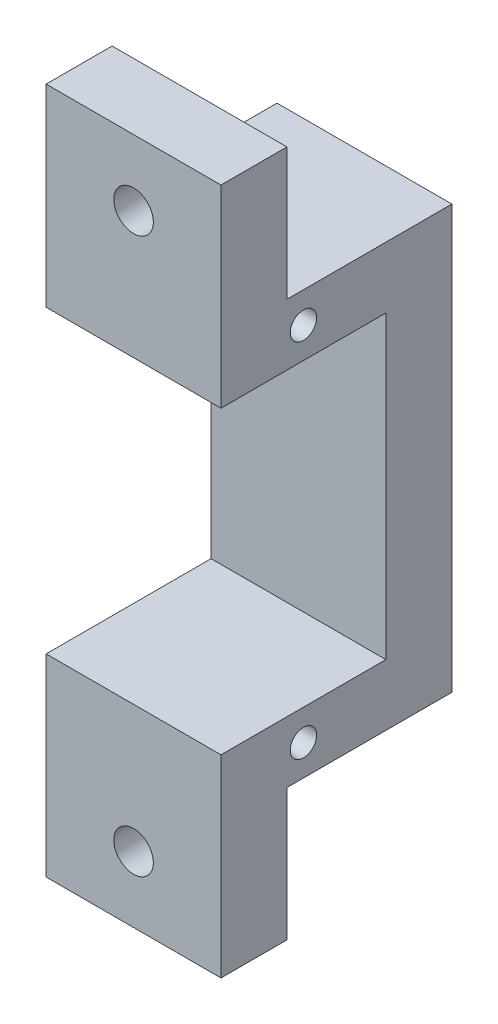
ISO-10303-21;
HEADER;
FILE_DESCRIPTION(('STEP AP214'),'2;1');
FILE_NAME('part.step','',(''),(''),'','','');
FILE_SCHEMA(('AUTOMOTIVE_DESIGN { 1 0 10303 214 1 1 1 1 }'));
ENDSEC;
DATA;
#1=APPLICATION_CONTEXT('core data for automotive mechanical design processes');
#2=APPLICATION_PROTOCOL_DEFINITION('international standard','automotive_design',2000,#1);
#3=PRODUCT_CONTEXT('',#1,'mechanical');
#4=PRODUCT('Part','Part','',(#3));
#5=PRODUCT_RELATED_PRODUCT_CATEGORY('part','',(#4));
#6=PRODUCT_DEFINITION_FORMATION('','',#4);
#7=PRODUCT_DEFINITION_CONTEXT('part definition',#1,'design');
#8=PRODUCT_DEFINITION('design','',#6,#7);
#9=PRODUCT_DEFINITION_SHAPE('','',#8);
#10=(LENGTH_UNIT() NAMED_UNIT(*) SI_UNIT(.MILLI.,.METRE.));
#11=(NAMED_UNIT(*) PLANE_ANGLE_UNIT() SI_UNIT($,.RADIAN.));
#12=(NAMED_UNIT(*) SI_UNIT($,.STERADIAN.) SOLID_ANGLE_UNIT());
#13=UNCERTAINTY_MEASURE_WITH_UNIT(LENGTH_MEASURE(1.E-05),#10,'distance_accuracy_value','');
#14=(GEOMETRIC_REPRESENTATION_CONTEXT(3) GLOBAL_UNCERTAINTY_ASSIGNED_CONTEXT((#13)) GLOBAL_UNIT_ASSIGNED_CONTEXT((#10,
#11,#12)) REPRESENTATION_CONTEXT('',''));
#15=CARTESIAN_POINT('',(0.,0.,0.));
#16=DIRECTION('',(0.,0.,1.));
#17=DIRECTION('',(1.,0.,0.));
#18=AXIS2_PLACEMENT_3D('',#15,#16,#17);
#19=CARTESIAN_POINT('',(-21.7379181981433,-32.05,1.16179769840603));
#20=DIRECTION('',(0.,1.,0.));
#21=DIRECTION('',(-1.,0.,0.));
#22=AXIS2_PLACEMENT_3D('',#19,#20,#21);
#23=PLANE('',#22);
#24=DIRECTION('',(1.,0.,0.));
#25=VECTOR('',#24,1.);
#26=CARTESIAN_POINT('',(-21.7379181981433,-32.05,13.661797698406));
#27=LINE('',#26,#25);
#28=CARTESIAN_POINT('',(-21.7379181981433,-32.05,13.661797698406));
#29=VERTEX_POINT('',#28);
#30=CARTESIAN_POINT('',(-8.48791819814331,-32.05,13.661797698406));
#31=VERTEX_POINT('',#30);
#32=EDGE_CURVE('E55',#29,#31,#27,.T.);
#33=ORIENTED_EDGE('',*,*,#32,.F.);
#34=DIRECTION('',(0.,0.,1.));
#35=VECTOR('',#34,1.);
#36=CARTESIAN_POINT('',(-21.7379181981433,-32.05,1.16179769840603));
#37=LINE('',#36,#35);
#38=CARTESIAN_POINT('',(-21.7379181981433,-32.05,1.16179769840603));
#39=VERTEX_POINT('',#38);
#40=EDGE_CURVE('E199',#39,#29,#37,.T.);
#41=ORIENTED_EDGE('',*,*,#40,.F.);
#42=DIRECTION('',(-1.,0.,0.));
#43=VECTOR('',#42,1.);
#44=CARTESIAN_POINT('',(-21.7379181981433,-32.05,1.16179769840603));
#45=LINE('',#44,#43);
#46=CARTESIAN_POINT('',(-8.48791819814331,-32.05,1.16179769840603));
#47=VERTEX_POINT('',#46);
#48=EDGE_CURVE('E197',#47,#39,#45,.T.);
#49=ORIENTED_EDGE('',*,*,#48,.F.);
#50=DIRECTION('',(0.,0.,1.));
#51=VECTOR('',#50,1.);
#52=CARTESIAN_POINT('',(-8.48791819814331,-32.05,1.16179769840603));
#53=LINE('',#52,#51);
#54=EDGE_CURVE('E204',#47,#31,#53,.T.);
#55=ORIENTED_EDGE('',*,*,#54,.T.);
#56=EDGE_LOOP('',(#33,#41,#49,#55));
#57=FACE_BOUND('',#56,.T.);
#58=ADVANCED_FACE('F32',(#57),#23,.F.);
#59=CARTESIAN_POINT('',(0.,0.,6.16179769840603));
#60=DIRECTION('',(0.,0.,1.));
#61=DIRECTION('',(1.,0.,0.));
#62=AXIS2_PLACEMENT_3D('',#59,#60,#61);
#63=PLANE('',#62);
#64=DIRECTION('',(0.,1.,0.));
#65=VECTOR('',#64,1.);
#66=CARTESIAN_POINT('',(-21.7379181981433,0.,6.16179769840603));
#67=LINE('',#66,#65);
#68=CARTESIAN_POINT('',(-21.7379181981433,-27.4,6.16179769840603));
#69=VERTEX_POINT('',#68);
#70=CARTESIAN_POINT('',(-21.7379181981433,-4.65,6.16179769840603));
#71=VERTEX_POINT('',#70);
#72=EDGE_CURVE('E187',#69,#71,#67,.T.);
#73=ORIENTED_EDGE('',*,*,#72,.F.);
#74=DIRECTION('',(-1.,0.,0.));
#75=VECTOR('',#74,1.);
#76=CARTESIAN_POINT('',(-8.48791819814331,-27.4,6.16179769840603));
#77=LINE('',#76,#75);
#78=CARTESIAN_POINT('',(-8.48791819814331,-27.4,6.16179769840603));
#79=VERTEX_POINT('',#78);
#80=EDGE_CURVE('E173',#79,#69,#77,.T.);
#81=ORIENTED_EDGE('',*,*,#80,.F.);
#82=DIRECTION('',(0.,-1.,0.));
#83=VECTOR('',#82,1.);
#84=CARTESIAN_POINT('',(-8.4879181981433,0.,6.16179769840603));
#85=LINE('',#84,#83);
#86=CARTESIAN_POINT('',(-8.4879181981433,-4.65,6.16179769840603));
#87=VERTEX_POINT('',#86);
#88=EDGE_CURVE('E192',#87,#79,#85,.T.);
#89=ORIENTED_EDGE('',*,*,#88,.F.);
#90=DIRECTION('',(-1.,0.,0.));
#91=VECTOR('',#90,1.);
#92=CARTESIAN_POINT('',(-21.7379181981433,-4.65,6.16179769840603));
#93=LINE('',#92,#91);
#94=EDGE_CURVE('E130',#87,#71,#93,.T.);
#95=ORIENTED_EDGE('',*,*,#94,.T.);
#96=EDGE_LOOP('',(#73,#81,#89,#95));
#97=FACE_BOUND('',#96,.T.);
#98=ADVANCED_FACE('F240',(#97),#63,.T.);
#99=CARTESIAN_POINT('',(-21.7379181981433,-4.65,6.16179769840603));
#100=DIRECTION('',(-1.,0.,0.));
#101=DIRECTION('',(0.,0.,1.));
#102=AXIS2_PLACEMENT_3D('',#99,#100,#101);
#103=PLANE('',#102);
#104=CARTESIAN_POINT('',(-21.7379181981433,-29.725,12.411797698406));
#105=DIRECTION('',(1.,0.,0.));
#106=DIRECTION('',(0.,0.,-1.));
#107=AXIS2_PLACEMENT_3D('',#104,#105,#106);
#108=CIRCLE('',#107,1.);
#109=CARTESIAN_POINT('',(-21.7379181981433,-29.725,11.411797698406));
#110=VERTEX_POINT('',#109);
#111=EDGE_CURVE('E301',#110,#110,#108,.T.);
#112=ORIENTED_EDGE('',*,*,#111,.T.);
#113=EDGE_LOOP('',(#112));
#114=FACE_BOUND('',#113,.T.);
#115=CARTESIAN_POINT('',(-21.7379181981433,-2.325,12.411797698406));
#116=DIRECTION('',(1.,0.,0.));
#117=DIRECTION('',(0.,0.,-1.));
#118=AXIS2_PLACEMENT_3D('',#115,#116,#117);
#119=CIRCLE('',#118,1.);
#120=CARTESIAN_POINT('',(-21.7379181981433,-2.325,11.411797698406));
#121=VERTEX_POINT('',#120);
#122=EDGE_CURVE('E297',#121,#121,#119,.T.);
#123=ORIENTED_EDGE('',*,*,#122,.T.);
#124=EDGE_LOOP('',(#123));
#125=FACE_BOUND('',#124,.T.);
#126=DIRECTION('',(0.,0.,1.));
#127=VECTOR('',#126,1.);
#128=CARTESIAN_POINT('',(-21.7379181981433,0.,6.16179769840603));
#129=LINE('',#128,#127);
#130=CARTESIAN_POINT('',(-21.7379181981433,0.,1.16179769840603));
#131=VERTEX_POINT('',#130);
#132=CARTESIAN_POINT('',(-21.7379181981433,0.,13.661797698406));
#133=VERTEX_POINT('',#132);
#134=EDGE_CURVE('E206',#131,#133,#129,.T.);
#135=ORIENTED_EDGE('',*,*,#134,.F.);
#136=DIRECTION('',(0.,1.,0.));
#137=VECTOR('',#136,1.);
#138=CARTESIAN_POINT('',(-21.7379181981433,0.,1.16179769840603));
#139=LINE('',#138,#137);
#140=EDGE_CURVE('E188',#39,#131,#139,.T.);
#141=ORIENTED_EDGE('',*,*,#140,.F.);
#142=ORIENTED_EDGE('',*,*,#40,.T.);
#143=DIRECTION('',(0.,1.,0.));
#144=VECTOR('',#143,1.);
#145=CARTESIAN_POINT('',(-21.7379181981433,-42.05,13.661797698406));
#146=LINE('',#145,#144);
#147=CARTESIAN_POINT('',(-21.7379181981433,-42.05,13.661797698406));
#148=VERTEX_POINT('',#147);
#149=EDGE_CURVE('E170',#148,#29,#146,.T.);
#150=ORIENTED_EDGE('',*,*,#149,.F.);
#151=DIRECTION('',(0.,0.,-1.));
#152=VECTOR('',#151,1.);
#153=CARTESIAN_POINT('',(-21.7379181981433,-42.05,18.661797698406));
#154=LINE('',#153,#152);
#155=CARTESIAN_POINT('',(-21.7379181981433,-42.05,18.661797698406));
#156=VERTEX_POINT('',#155);
#157=EDGE_CURVE('E155',#156,#148,#154,.T.);
#158=ORIENTED_EDGE('',*,*,#157,.F.);
#159=DIRECTION('',(0.,-1.,0.));
#160=VECTOR('',#159,1.);
#161=CARTESIAN_POINT('',(-21.7379181981433,-32.05,18.661797698406));
#162=LINE('',#161,#160);
#163=CARTESIAN_POINT('',(-21.7379181981433,-27.4,18.661797698406));
#164=VERTEX_POINT('',#163);
#165=EDGE_CURVE('E179',#164,#156,#162,.T.);
#166=ORIENTED_EDGE('',*,*,#165,.F.);
#167=DIRECTION('',(0.,0.,-1.));
#168=VECTOR('',#167,1.);
#169=CARTESIAN_POINT('',(-21.7379181981433,-27.4,18.661797698406));
#170=LINE('',#169,#168);
#171=EDGE_CURVE('E181',#164,#69,#170,.T.);
#172=ORIENTED_EDGE('',*,*,#171,.T.);
#173=ORIENTED_EDGE('',*,*,#72,.T.);
#174=DIRECTION('',(0.,0.,1.));
#175=VECTOR('',#174,1.);
#176=CARTESIAN_POINT('',(-21.7379181981433,-4.65,6.16179769840603));
#177=LINE('',#176,#175);
#178=CARTESIAN_POINT('',(-21.7379181981433,-4.65,18.661797698406));
#179=VERTEX_POINT('',#178);
#180=EDGE_CURVE('E126',#71,#179,#177,.T.);
#181=ORIENTED_EDGE('',*,*,#180,.T.);
#182=DIRECTION('',(0.,1.,0.));
#183=VECTOR('',#182,1.);
#184=CARTESIAN_POINT('',(-21.7379181981433,-4.65,18.661797698406));
#185=LINE('',#184,#183);
#186=CARTESIAN_POINT('',(-21.7379181981433,10.,18.661797698406));
#187=VERTEX_POINT('',#186);
#188=EDGE_CURVE('E36',#179,#187,#185,.T.);
#189=ORIENTED_EDGE('',*,*,#188,.T.);
#190=DIRECTION('',(0.,0.,1.));
#191=VECTOR('',#190,1.);
#192=CARTESIAN_POINT('',(-21.7379181981433,10.,18.661797698406));
#193=LINE('',#192,#191);
#194=CARTESIAN_POINT('',(-21.7379181981433,10.,13.661797698406));
#195=VERTEX_POINT('',#194);
#196=EDGE_CURVE('E124',#195,#187,#193,.T.);
#197=ORIENTED_EDGE('',*,*,#196,.F.);
#198=DIRECTION('',(0.,-1.,0.));
#199=VECTOR('',#198,1.);
#200=CARTESIAN_POINT('',(-21.7379181981433,10.,13.661797698406));
#201=LINE('',#200,#199);
#202=EDGE_CURVE('E149',#195,#133,#201,.T.);
#203=ORIENTED_EDGE('',*,*,#202,.T.);
#204=EDGE_LOOP('',(#135,#141,#142,#150,#158,#166,#172,#173,#181,#189,#197,#203));
#205=FACE_BOUND('',#204,.T.);
#206=ADVANCED_FACE('F34',(#114,#125,#205),#103,.T.);
#207=CARTESIAN_POINT('',(-8.4879181981433,-4.65,6.16179769840603));
#208=DIRECTION('',(1.,0.,0.));
#209=DIRECTION('',(0.,0.,-1.));
#210=AXIS2_PLACEMENT_3D('',#207,#208,#209);
#211=PLANE('',#210);
#212=CARTESIAN_POINT('',(-8.4879181981433,-29.725,12.411797698406));
#213=DIRECTION('',(1.,0.,0.));
#214=DIRECTION('',(0.,0.,-1.));
#215=AXIS2_PLACEMENT_3D('',#212,#213,#214);
#216=CIRCLE('',#215,1.);
#217=CARTESIAN_POINT('',(-8.4879181981433,-29.725,11.411797698406));
#218=VERTEX_POINT('',#217);
#219=EDGE_CURVE('E304',#218,#218,#216,.T.);
#220=ORIENTED_EDGE('',*,*,#219,.F.);
#221=EDGE_LOOP('',(#220));
#222=FACE_BOUND('',#221,.T.);
#223=CARTESIAN_POINT('',(-8.4879181981433,-2.325,12.411797698406));
#224=DIRECTION('',(1.,0.,0.));
#225=DIRECTION('',(0.,0.,-1.));
#226=AXIS2_PLACEMENT_3D('',#223,#224,#225);
#227=CIRCLE('',#226,1.);
#228=CARTESIAN_POINT('',(-8.4879181981433,-2.325,11.411797698406));
#229=VERTEX_POINT('',#228);
#230=EDGE_CURVE('E298',#229,#229,#227,.T.);
#231=ORIENTED_EDGE('',*,*,#230,.F.);
#232=EDGE_LOOP('',(#231));
#233=FACE_BOUND('',#232,.T.);
#234=DIRECTION('',(0.,0.,-1.));
#235=VECTOR('',#234,1.);
#236=CARTESIAN_POINT('',(-8.4879181981433,0.,6.16179769840603));
#237=LINE('',#236,#235);
#238=CARTESIAN_POINT('',(-8.4879181981433,0.,13.661797698406));
#239=VERTEX_POINT('',#238);
#240=CARTESIAN_POINT('',(-8.4879181981433,0.,1.16179769840603));
#241=VERTEX_POINT('',#240);
#242=EDGE_CURVE('E209',#239,#241,#237,.T.);
#243=ORIENTED_EDGE('',*,*,#242,.F.);
#244=DIRECTION('',(0.,-1.,0.));
#245=VECTOR('',#244,1.);
#246=CARTESIAN_POINT('',(-8.4879181981433,10.,13.661797698406));
#247=LINE('',#246,#245);
#248=CARTESIAN_POINT('',(-8.4879181981433,10.,13.661797698406));
#249=VERTEX_POINT('',#248);
#250=EDGE_CURVE('E152',#249,#239,#247,.T.);
#251=ORIENTED_EDGE('',*,*,#250,.F.);
#252=DIRECTION('',(0.,0.,-1.));
#253=VECTOR('',#252,1.);
#254=CARTESIAN_POINT('',(-8.4879181981433,10.,18.661797698406));
#255=LINE('',#254,#253);
#256=CARTESIAN_POINT('',(-8.4879181981433,10.,18.661797698406));
#257=VERTEX_POINT('',#256);
#258=EDGE_CURVE('E136',#257,#249,#255,.T.);
#259=ORIENTED_EDGE('',*,*,#258,.F.);
#260=DIRECTION('',(0.,1.,0.));
#261=VECTOR('',#260,1.);
#262=CARTESIAN_POINT('',(-8.4879181981433,-4.65,18.661797698406));
#263=LINE('',#262,#261);
#264=CARTESIAN_POINT('',(-8.4879181981433,-4.65,18.661797698406));
#265=VERTEX_POINT('',#264);
#266=EDGE_CURVE('E11',#265,#257,#263,.T.);
#267=ORIENTED_EDGE('',*,*,#266,.F.);
#268=DIRECTION('',(0.,0.,-1.));
#269=VECTOR('',#268,1.);
#270=CARTESIAN_POINT('',(-8.4879181981433,-4.65,6.16179769840603));
#271=LINE('',#270,#269);
#272=EDGE_CURVE('E211',#265,#87,#271,.T.);
#273=ORIENTED_EDGE('',*,*,#272,.T.);
#274=ORIENTED_EDGE('',*,*,#88,.T.);
#275=DIRECTION('',(0.,0.,-1.));
#276=VECTOR('',#275,1.);
#277=CARTESIAN_POINT('',(-8.48791819814331,-27.4,18.661797698406));
#278=LINE('',#277,#276);
#279=CARTESIAN_POINT('',(-8.48791819814331,-27.4,18.661797698406));
#280=VERTEX_POINT('',#279);
#281=EDGE_CURVE('E185',#280,#79,#278,.T.);
#282=ORIENTED_EDGE('',*,*,#281,.F.);
#283=DIRECTION('',(0.,1.,0.));
#284=VECTOR('',#283,1.);
#285=CARTESIAN_POINT('',(-8.48791819814331,-32.05,18.661797698406));
#286=LINE('',#285,#284);
#287=CARTESIAN_POINT('',(-8.48791819814331,-42.05,18.661797698406));
#288=VERTEX_POINT('',#287);
#289=EDGE_CURVE('E174',#288,#280,#286,.T.);
#290=ORIENTED_EDGE('',*,*,#289,.F.);
#291=DIRECTION('',(0.,0.,1.));
#292=VECTOR('',#291,1.);
#293=CARTESIAN_POINT('',(-8.48791819814331,-42.05,18.661797698406));
#294=LINE('',#293,#292);
#295=CARTESIAN_POINT('',(-8.48791819814331,-42.05,13.661797698406));
#296=VERTEX_POINT('',#295);
#297=EDGE_CURVE('E160',#296,#288,#294,.T.);
#298=ORIENTED_EDGE('',*,*,#297,.F.);
#299=DIRECTION('',(0.,1.,0.));
#300=VECTOR('',#299,1.);
#301=CARTESIAN_POINT('',(-8.48791819814331,-42.05,13.661797698406));
#302=LINE('',#301,#300);
#303=EDGE_CURVE('E166',#296,#31,#302,.T.);
#304=ORIENTED_EDGE('',*,*,#303,.T.);
#305=ORIENTED_EDGE('',*,*,#54,.F.);
#306=DIRECTION('',(0.,-1.,0.));
#307=VECTOR('',#306,1.);
#308=CARTESIAN_POINT('',(-8.4879181981433,0.,1.16179769840603));
#309=LINE('',#308,#307);
#310=EDGE_CURVE('E195',#241,#47,#309,.T.);
#311=ORIENTED_EDGE('',*,*,#310,.F.);
#312=EDGE_LOOP('',(#243,#251,#259,#267,#273,#274,#282,#290,#298,#304,#305,#311));
#313=FACE_BOUND('',#312,.T.);
#314=ADVANCED_FACE('F225',(#222,#233,#313),#211,.T.);
#315=CARTESIAN_POINT('',(-21.7379181981433,-4.65,18.661797698406));
#316=DIRECTION('',(0.,0.,1.));
#317=DIRECTION('',(1.,0.,0.));
#318=AXIS2_PLACEMENT_3D('',#315,#316,#317);
#319=PLANE('',#318);
#320=CARTESIAN_POINT('',(-15.1129181981433,5.,18.661797698406));
#321=DIRECTION('',(0.,0.,1.));
#322=DIRECTION('',(1.,0.,0.));
#323=AXIS2_PLACEMENT_3D('',#320,#321,#322);
#324=CIRCLE('',#323,1.5);
#325=CARTESIAN_POINT('',(-13.6129181981433,5.,18.661797698406));
#326=VERTEX_POINT('',#325);
#327=EDGE_CURVE('E143',#326,#326,#324,.T.);
#328=ORIENTED_EDGE('',*,*,#327,.F.);
#329=EDGE_LOOP('',(#328));
#330=FACE_BOUND('',#329,.T.);
#331=ORIENTED_EDGE('',*,*,#266,.T.);
#332=DIRECTION('',(1.,0.,0.));
#333=VECTOR('',#332,1.);
#334=CARTESIAN_POINT('',(-21.7379181981433,10.,18.661797698406));
#335=LINE('',#334,#333);
#336=EDGE_CURVE('E132',#187,#257,#335,.T.);
#337=ORIENTED_EDGE('',*,*,#336,.F.);
#338=ORIENTED_EDGE('',*,*,#188,.F.);
#339=DIRECTION('',(1.,0.,0.));
#340=VECTOR('',#339,1.);
#341=CARTESIAN_POINT('',(-21.7379181981433,-4.65,18.661797698406));
#342=LINE('',#341,#340);
#343=EDGE_CURVE('E208',#179,#265,#342,.T.);
#344=ORIENTED_EDGE('',*,*,#343,.T.);
#345=EDGE_LOOP('',(#331,#337,#338,#344));
#346=FACE_BOUND('',#345,.T.);
#347=ADVANCED_FACE('F133',(#330,#346),#319,.T.);
#348=CARTESIAN_POINT('',(0.,-4.65,0.));
#349=DIRECTION('',(0.,1.,0.));
#350=DIRECTION('',(0.,0.,1.));
#351=AXIS2_PLACEMENT_3D('',#348,#349,#350);
#352=PLANE('',#351);
#353=ORIENTED_EDGE('',*,*,#180,.F.);
#354=ORIENTED_EDGE('',*,*,#94,.F.);
#355=ORIENTED_EDGE('',*,*,#272,.F.);
#356=ORIENTED_EDGE('',*,*,#343,.F.);
#357=EDGE_LOOP('',(#353,#354,#355,#356));
#358=FACE_BOUND('',#357,.T.);
#359=ADVANCED_FACE('F235',(#358),#352,.F.);
#360=CARTESIAN_POINT('',(0.,0.,0.));
#361=DIRECTION('',(0.,1.,0.));
#362=DIRECTION('',(0.,0.,1.));
#363=AXIS2_PLACEMENT_3D('',#360,#361,#362);
#364=PLANE('',#363);
#365=DIRECTION('',(-1.,0.,0.));
#366=VECTOR('',#365,1.);
#367=CARTESIAN_POINT('',(-21.7379181981433,0.,13.661797698406));
#368=LINE('',#367,#366);
#369=EDGE_CURVE('E47',#239,#133,#368,.T.);
#370=ORIENTED_EDGE('',*,*,#369,.F.);
#371=ORIENTED_EDGE('',*,*,#242,.T.);
#372=DIRECTION('',(1.,0.,0.));
#373=VECTOR('',#372,1.);
#374=CARTESIAN_POINT('',(-21.7379181981433,0.,1.16179769840603));
#375=LINE('',#374,#373);
#376=EDGE_CURVE('E191',#131,#241,#375,.T.);
#377=ORIENTED_EDGE('',*,*,#376,.F.);
#378=ORIENTED_EDGE('',*,*,#134,.T.);
#379=EDGE_LOOP('',(#370,#371,#377,#378));
#380=FACE_BOUND('',#379,.T.);
#381=ADVANCED_FACE('F217',(#380),#364,.T.);
#382=CARTESIAN_POINT('',(0.,0.,1.16179769840603));
#383=DIRECTION('',(0.,0.,1.));
#384=DIRECTION('',(1.,0.,0.));
#385=AXIS2_PLACEMENT_3D('',#382,#383,#384);
#386=PLANE('',#385);
#387=ORIENTED_EDGE('',*,*,#140,.T.);
#388=ORIENTED_EDGE('',*,*,#376,.T.);
#389=ORIENTED_EDGE('',*,*,#310,.T.);
#390=ORIENTED_EDGE('',*,*,#48,.T.);
#391=EDGE_LOOP('',(#387,#388,#389,#390));
#392=FACE_BOUND('',#391,.T.);
#393=ADVANCED_FACE('F222',(#392),#386,.F.);
#394=CARTESIAN_POINT('',(-8.48791819814331,-27.4,18.661797698406));
#395=DIRECTION('',(0.,-1.,0.));
#396=DIRECTION('',(1.,0.,0.));
#397=AXIS2_PLACEMENT_3D('',#394,#395,#396);
#398=PLANE('',#397);
#399=ORIENTED_EDGE('',*,*,#80,.T.);
#400=ORIENTED_EDGE('',*,*,#171,.F.);
#401=DIRECTION('',(-1.,0.,0.));
#402=VECTOR('',#401,1.);
#403=CARTESIAN_POINT('',(-8.48791819814331,-27.4,18.661797698406));
#404=LINE('',#403,#402);
#405=EDGE_CURVE('E177',#280,#164,#404,.T.);
#406=ORIENTED_EDGE('',*,*,#405,.F.);
#407=ORIENTED_EDGE('',*,*,#281,.T.);
#408=EDGE_LOOP('',(#399,#400,#406,#407));
#409=FACE_BOUND('',#408,.T.);
#410=ADVANCED_FACE('F243',(#409),#398,.F.);
#411=CARTESIAN_POINT('',(0.,0.,18.661797698406));
#412=DIRECTION('',(0.,0.,1.));
#413=DIRECTION('',(1.,0.,0.));
#414=AXIS2_PLACEMENT_3D('',#411,#412,#413);
#415=PLANE('',#414);
#416=CARTESIAN_POINT('',(-15.1129181981433,-37.05,18.661797698406));
#417=DIRECTION('',(0.,0.,1.));
#418=DIRECTION('',(1.,0.,0.));
#419=AXIS2_PLACEMENT_3D('',#416,#417,#418);
#420=CIRCLE('',#419,1.5);
#421=CARTESIAN_POINT('',(-13.6129181981433,-37.05,18.661797698406));
#422=VERTEX_POINT('',#421);
#423=EDGE_CURVE('E288',#422,#422,#420,.T.);
#424=ORIENTED_EDGE('',*,*,#423,.F.);
#425=EDGE_LOOP('',(#424));
#426=FACE_BOUND('',#425,.T.);
#427=ORIENTED_EDGE('',*,*,#289,.T.);
#428=ORIENTED_EDGE('',*,*,#405,.T.);
#429=ORIENTED_EDGE('',*,*,#165,.T.);
#430=DIRECTION('',(-1.,0.,0.));
#431=VECTOR('',#430,1.);
#432=CARTESIAN_POINT('',(-21.7379181981433,-42.05,18.661797698406));
#433=LINE('',#432,#431);
#434=EDGE_CURVE('E163',#288,#156,#433,.T.);
#435=ORIENTED_EDGE('',*,*,#434,.F.);
#436=EDGE_LOOP('',(#427,#428,#429,#435));
#437=FACE_BOUND('',#436,.T.);
#438=ADVANCED_FACE('F248',(#426,#437),#415,.T.);
#439=CARTESIAN_POINT('',(-21.7379181981433,-42.05,13.661797698406));
#440=DIRECTION('',(0.,0.,1.));
#441=DIRECTION('',(1.,0.,0.));
#442=AXIS2_PLACEMENT_3D('',#439,#440,#441);
#443=PLANE('',#442);
#444=CARTESIAN_POINT('',(-15.1129181981433,-37.05,13.661797698406));
#445=DIRECTION('',(0.,0.,-1.));
#446=DIRECTION('',(-1.,0.,0.));
#447=AXIS2_PLACEMENT_3D('',#444,#445,#446);
#448=CIRCLE('',#447,1.5);
#449=CARTESIAN_POINT('',(-16.6129181981433,-37.05,13.661797698406));
#450=VERTEX_POINT('',#449);
#451=EDGE_CURVE('E292',#450,#450,#448,.T.);
#452=ORIENTED_EDGE('',*,*,#451,.F.);
#453=EDGE_LOOP('',(#452));
#454=FACE_BOUND('',#453,.T.);
#455=ORIENTED_EDGE('',*,*,#32,.T.);
#456=ORIENTED_EDGE('',*,*,#303,.F.);
#457=DIRECTION('',(1.,0.,0.));
#458=VECTOR('',#457,1.);
#459=CARTESIAN_POINT('',(-21.7379181981433,-42.05,13.661797698406));
#460=LINE('',#459,#458);
#461=EDGE_CURVE('E158',#148,#296,#460,.T.);
#462=ORIENTED_EDGE('',*,*,#461,.F.);
#463=ORIENTED_EDGE('',*,*,#149,.T.);
#464=EDGE_LOOP('',(#455,#456,#462,#463));
#465=FACE_BOUND('',#464,.T.);
#466=ADVANCED_FACE('F253',(#454,#465),#443,.F.);
#467=CARTESIAN_POINT('',(0.,-42.05,0.));
#468=DIRECTION('',(0.,-1.,0.));
#469=DIRECTION('',(1.,0.,0.));
#470=AXIS2_PLACEMENT_3D('',#467,#468,#469);
#471=PLANE('',#470);
#472=ORIENTED_EDGE('',*,*,#157,.T.);
#473=ORIENTED_EDGE('',*,*,#461,.T.);
#474=ORIENTED_EDGE('',*,*,#297,.T.);
#475=ORIENTED_EDGE('',*,*,#434,.T.);
#476=EDGE_LOOP('',(#472,#473,#474,#475));
#477=FACE_BOUND('',#476,.T.);
#478=ADVANCED_FACE('F251',(#477),#471,.T.);
#479=CARTESIAN_POINT('',(-21.7379181981433,10.,13.661797698406));
#480=DIRECTION('',(0.,0.,1.));
#481=DIRECTION('',(1.,0.,0.));
#482=AXIS2_PLACEMENT_3D('',#479,#480,#481);
#483=PLANE('',#482);
#484=CARTESIAN_POINT('',(-15.1129181981433,5.,13.661797698406));
#485=DIRECTION('',(0.,0.,-1.));
#486=DIRECTION('',(-1.,0.,0.));
#487=AXIS2_PLACEMENT_3D('',#484,#485,#486);
#488=CIRCLE('',#487,1.5);
#489=CARTESIAN_POINT('',(-16.6129181981433,5.,13.661797698406));
#490=VERTEX_POINT('',#489);
#491=EDGE_CURVE('E286',#490,#490,#488,.T.);
#492=ORIENTED_EDGE('',*,*,#491,.F.);
#493=EDGE_LOOP('',(#492));
#494=FACE_BOUND('',#493,.T.);
#495=ORIENTED_EDGE('',*,*,#369,.T.);
#496=ORIENTED_EDGE('',*,*,#202,.F.);
#497=DIRECTION('',(-1.,0.,0.));
#498=VECTOR('',#497,1.);
#499=CARTESIAN_POINT('',(-21.7379181981433,10.,13.661797698406));
#500=LINE('',#499,#498);
#501=EDGE_CURVE('E140',#249,#195,#500,.T.);
#502=ORIENTED_EDGE('',*,*,#501,.F.);
#503=ORIENTED_EDGE('',*,*,#250,.T.);
#504=EDGE_LOOP('',(#495,#496,#502,#503));
#505=FACE_BOUND('',#504,.T.);
#506=ADVANCED_FACE('F231',(#494,#505),#483,.F.);
#507=CARTESIAN_POINT('',(0.,10.,0.));
#508=DIRECTION('',(0.,-1.,0.));
#509=DIRECTION('',(0.,0.,-1.));
#510=AXIS2_PLACEMENT_3D('',#507,#508,#509);
#511=PLANE('',#510);
#512=ORIENTED_EDGE('',*,*,#196,.T.);
#513=ORIENTED_EDGE('',*,*,#336,.T.);
#514=ORIENTED_EDGE('',*,*,#258,.T.);
#515=ORIENTED_EDGE('',*,*,#501,.T.);
#516=EDGE_LOOP('',(#512,#513,#514,#515));
#517=FACE_BOUND('',#516,.T.);
#518=ADVANCED_FACE('F138',(#517),#511,.F.);
#519=CARTESIAN_POINT('',(-15.1129181981433,5.,23.661797698406));
#520=DIRECTION('',(0.,0.,-1.));
#521=DIRECTION('',(-1.,0.,0.));
#522=AXIS2_PLACEMENT_3D('',#519,#520,#521);
#523=CYLINDRICAL_SURFACE('',#522,1.5);
#524=ORIENTED_EDGE('',*,*,#327,.T.);
#525=EDGE_LOOP('',(#524));
#526=FACE_BOUND('',#525,.T.);
#527=ORIENTED_EDGE('',*,*,#491,.T.);
#528=EDGE_LOOP('',(#527));
#529=FACE_BOUND('',#528,.T.);
#530=ADVANCED_FACE('F328',(#526,#529),#523,.F.);
#531=CARTESIAN_POINT('',(-15.1129181981433,-37.05,23.661797698406));
#532=DIRECTION('',(0.,0.,-1.));
#533=DIRECTION('',(-1.,0.,0.));
#534=AXIS2_PLACEMENT_3D('',#531,#532,#533);
#535=CYLINDRICAL_SURFACE('',#534,1.5);
#536=ORIENTED_EDGE('',*,*,#423,.T.);
#537=EDGE_LOOP('',(#536));
#538=FACE_BOUND('',#537,.T.);
#539=ORIENTED_EDGE('',*,*,#451,.T.);
#540=EDGE_LOOP('',(#539));
#541=FACE_BOUND('',#540,.T.);
#542=ADVANCED_FACE('F322',(#538,#541),#535,.F.);
#543=CARTESIAN_POINT('',(-21.7379181981433,-2.325,12.411797698406));
#544=DIRECTION('',(1.,0.,0.));
#545=DIRECTION('',(0.,0.,-1.));
#546=AXIS2_PLACEMENT_3D('',#543,#544,#545);
#547=CYLINDRICAL_SURFACE('',#546,1.);
#548=CARTESIAN_POINT('',(-21.7379181981433,-2.325,11.411797698406));
#549=CARTESIAN_POINT('',(-21.59989736481,-2.325,11.411797698406));
#550=CARTESIAN_POINT('',(-21.4618765314766,-2.325,11.411797698406));
#551=CARTESIAN_POINT('',(-21.18583486481,-2.325,11.411797698406));
#552=CARTESIAN_POINT('',(-21.0478140314766,-2.325,11.411797698406));
#553=CARTESIAN_POINT('',(-20.77177236481,-2.325,11.411797698406));
#554=CARTESIAN_POINT('',(-20.6337515314766,-2.325,11.411797698406));
#555=CARTESIAN_POINT('',(-20.35770986481,-2.325,11.411797698406));
#556=CARTESIAN_POINT('',(-20.2196890314766,-2.325,11.411797698406));
#557=CARTESIAN_POINT('',(-19.94364736481,-2.325,11.411797698406));
#558=CARTESIAN_POINT('',(-19.8056265314766,-2.325,11.411797698406));
#559=CARTESIAN_POINT('',(-19.52958486481,-2.325,11.411797698406));
#560=CARTESIAN_POINT('',(-19.3915640314766,-2.325,11.411797698406));
#561=CARTESIAN_POINT('',(-19.11552236481,-2.325,11.411797698406));
#562=CARTESIAN_POINT('',(-18.9775015314766,-2.325,11.411797698406));
#563=CARTESIAN_POINT('',(-18.70145986481,-2.325,11.411797698406));
#564=CARTESIAN_POINT('',(-18.5634390314766,-2.325,11.411797698406));
#565=CARTESIAN_POINT('',(-18.28739736481,-2.325,11.411797698406));
#566=CARTESIAN_POINT('',(-18.1493765314766,-2.325,11.411797698406));
#567=CARTESIAN_POINT('',(-17.87333486481,-2.325,11.411797698406));
#568=CARTESIAN_POINT('',(-17.7353140314766,-2.325,11.411797698406));
#569=CARTESIAN_POINT('',(-17.45927236481,-2.325,11.411797698406));
#570=CARTESIAN_POINT('',(-17.3212515314766,-2.325,11.411797698406));
#571=CARTESIAN_POINT('',(-17.04520986481,-2.325,11.411797698406));
#572=CARTESIAN_POINT('',(-16.9071890314766,-2.325,11.411797698406));
#573=CARTESIAN_POINT('',(-16.63114736481,-2.325,11.411797698406));
#574=CARTESIAN_POINT('',(-16.4931265314766,-2.325,11.411797698406));
#575=CARTESIAN_POINT('',(-16.21708486481,-2.325,11.411797698406));
#576=CARTESIAN_POINT('',(-16.0790640314766,-2.325,11.411797698406));
#577=CARTESIAN_POINT('',(-15.80302236481,-2.325,11.411797698406));
#578=CARTESIAN_POINT('',(-15.6650015314766,-2.325,11.411797698406));
#579=CARTESIAN_POINT('',(-15.38895986481,-2.325,11.411797698406));
#580=CARTESIAN_POINT('',(-15.2509390314766,-2.325,11.411797698406));
#581=CARTESIAN_POINT('',(-14.97489736481,-2.325,11.411797698406));
#582=CARTESIAN_POINT('',(-14.8368765314766,-2.325,11.411797698406));
#583=CARTESIAN_POINT('',(-14.56083486481,-2.325,11.411797698406));
#584=CARTESIAN_POINT('',(-14.4228140314766,-2.325,11.411797698406));
#585=CARTESIAN_POINT('',(-14.14677236481,-2.325,11.411797698406));
#586=CARTESIAN_POINT('',(-14.0087515314766,-2.325,11.411797698406));
#587=CARTESIAN_POINT('',(-13.73270986481,-2.325,11.411797698406));
#588=CARTESIAN_POINT('',(-13.5946890314766,-2.325,11.411797698406));
#589=CARTESIAN_POINT('',(-13.31864736481,-2.325,11.411797698406));
#590=CARTESIAN_POINT('',(-13.1806265314766,-2.325,11.411797698406));
#591=CARTESIAN_POINT('',(-12.90458486481,-2.325,11.411797698406));
#592=CARTESIAN_POINT('',(-12.7665640314766,-2.325,11.411797698406));
#593=CARTESIAN_POINT('',(-12.49052236481,-2.325,11.411797698406));
#594=CARTESIAN_POINT('',(-12.3525015314766,-2.325,11.411797698406));
#595=CARTESIAN_POINT('',(-12.07645986481,-2.325,11.411797698406));
#596=CARTESIAN_POINT('',(-11.9384390314766,-2.325,11.411797698406));
#597=CARTESIAN_POINT('',(-11.66239736481,-2.325,11.411797698406));
#598=CARTESIAN_POINT('',(-11.5243765314766,-2.325,11.411797698406));
#599=CARTESIAN_POINT('',(-11.24833486481,-2.325,11.411797698406));
#600=CARTESIAN_POINT('',(-11.1103140314766,-2.325,11.411797698406));
#601=CARTESIAN_POINT('',(-10.83427236481,-2.325,11.411797698406));
#602=CARTESIAN_POINT('',(-10.6962515314766,-2.325,11.411797698406));
#603=CARTESIAN_POINT('',(-10.42020986481,-2.325,11.411797698406));
#604=CARTESIAN_POINT('',(-10.2821890314766,-2.325,11.411797698406));
#605=CARTESIAN_POINT('',(-10.00614736481,-2.325,11.411797698406));
#606=CARTESIAN_POINT('',(-9.86812653147664,-2.325,11.411797698406));
#607=CARTESIAN_POINT('',(-9.59208486480997,-2.325,11.411797698406));
#608=CARTESIAN_POINT('',(-9.45406403147664,-2.325,11.411797698406));
#609=CARTESIAN_POINT('',(-9.17802236480997,-2.325,11.411797698406));
#610=CARTESIAN_POINT('',(-9.04000153147664,-2.325,11.411797698406));
#611=CARTESIAN_POINT('',(-8.76395986480997,-2.325,11.411797698406));
#612=CARTESIAN_POINT('',(-8.62593903147664,-2.325,11.411797698406));
#613=CARTESIAN_POINT('',(-8.4879181981433,-2.325,11.411797698406));
#614=B_SPLINE_CURVE_WITH_KNOTS('',3,(#548,#549,#550,#551,#552,#553,#554,#555,#556,#557,#558,
#559,#560,#561,#562,#563,#564,#565,#566,#567,#568,#569,#570,#571,#572,#573,#574,#575,#576,#577,
#578,#579,#580,#581,#582,#583,#584,#585,#586,#587,#588,#589,#590,#591,#592,#593,#594,#595,#596,
#597,#598,#599,#600,#601,#602,#603,#604,#605,#606,#607,#608,#609,#610,#611,#612,#613),
.UNSPECIFIED.,.F.,.F.,(4,2,2,2,2,2,2,2,2,2,2,2,2,2,2,2,2,2,2,2,2,2,2,2,2,2,2,2,2,2,2,2,4),(0.,
0.4140625,0.828124999999999,1.2421875,1.65625,2.0703125,2.484375,2.8984375,3.3125,3.7265625,
4.140625,4.5546875,4.96875,5.3828125,5.796875,6.2109375,6.625,7.0390625,7.453125,7.8671875,
8.28125,8.6953125,9.109375,9.5234375,9.9375,10.3515625,10.765625,11.1796875,11.59375,12.0078125,
12.421875,12.8359375,13.25),.UNSPECIFIED.);
#615=EDGE_CURVE('BSEAM315',#121,#229,#614,.T.);
#616=ORIENTED_EDGE('',*,*,#122,.F.);
#617=ORIENTED_EDGE('',*,*,#230,.T.);
#618=ORIENTED_EDGE('',*,*,#615,.T.);
#619=ORIENTED_EDGE('',*,*,#615,.F.);
#620=EDGE_LOOP('',(#616,#618,#617,#619));
#621=FACE_BOUND('',#620,.T.);
#622=ADVANCED_FACE('F315',(#621),#547,.F.);
#623=CARTESIAN_POINT('',(-21.7379181981433,-29.725,12.411797698406));
#624=DIRECTION('',(1.,0.,0.));
#625=DIRECTION('',(0.,0.,-1.));
#626=AXIS2_PLACEMENT_3D('',#623,#624,#625);
#627=CYLINDRICAL_SURFACE('',#626,1.);
#628=CARTESIAN_POINT('',(-21.7379181981433,-29.725,11.411797698406));
#629=CARTESIAN_POINT('',(-21.59989736481,-29.725,11.411797698406));
#630=CARTESIAN_POINT('',(-21.4618765314766,-29.725,11.411797698406));
#631=CARTESIAN_POINT('',(-21.18583486481,-29.725,11.411797698406));
#632=CARTESIAN_POINT('',(-21.0478140314766,-29.725,11.411797698406));
#633=CARTESIAN_POINT('',(-20.77177236481,-29.725,11.411797698406));
#634=CARTESIAN_POINT('',(-20.6337515314766,-29.725,11.411797698406));
#635=CARTESIAN_POINT('',(-20.35770986481,-29.725,11.411797698406));
#636=CARTESIAN_POINT('',(-20.2196890314766,-29.725,11.411797698406));
#637=CARTESIAN_POINT('',(-19.94364736481,-29.725,11.411797698406));
#638=CARTESIAN_POINT('',(-19.8056265314766,-29.725,11.411797698406));
#639=CARTESIAN_POINT('',(-19.52958486481,-29.725,11.411797698406));
#640=CARTESIAN_POINT('',(-19.3915640314766,-29.725,11.411797698406));
#641=CARTESIAN_POINT('',(-19.11552236481,-29.725,11.411797698406));
#642=CARTESIAN_POINT('',(-18.9775015314766,-29.725,11.411797698406));
#643=CARTESIAN_POINT('',(-18.70145986481,-29.725,11.411797698406));
#644=CARTESIAN_POINT('',(-18.5634390314766,-29.725,11.411797698406));
#645=CARTESIAN_POINT('',(-18.28739736481,-29.725,11.411797698406));
#646=CARTESIAN_POINT('',(-18.1493765314766,-29.725,11.411797698406));
#647=CARTESIAN_POINT('',(-17.87333486481,-29.725,11.411797698406));
#648=CARTESIAN_POINT('',(-17.7353140314766,-29.725,11.411797698406));
#649=CARTESIAN_POINT('',(-17.45927236481,-29.725,11.411797698406));
#650=CARTESIAN_POINT('',(-17.3212515314766,-29.725,11.411797698406));
#651=CARTESIAN_POINT('',(-17.04520986481,-29.725,11.411797698406));
#652=CARTESIAN_POINT('',(-16.9071890314766,-29.725,11.411797698406));
#653=CARTESIAN_POINT('',(-16.63114736481,-29.725,11.411797698406));
#654=CARTESIAN_POINT('',(-16.4931265314766,-29.725,11.411797698406));
#655=CARTESIAN_POINT('',(-16.21708486481,-29.725,11.411797698406));
#656=CARTESIAN_POINT('',(-16.0790640314766,-29.725,11.411797698406));
#657=CARTESIAN_POINT('',(-15.80302236481,-29.725,11.411797698406));
#658=CARTESIAN_POINT('',(-15.6650015314766,-29.725,11.411797698406));
#659=CARTESIAN_POINT('',(-15.38895986481,-29.725,11.411797698406));
#660=CARTESIAN_POINT('',(-15.2509390314766,-29.725,11.411797698406));
#661=CARTESIAN_POINT('',(-14.97489736481,-29.725,11.411797698406));
#662=CARTESIAN_POINT('',(-14.8368765314766,-29.725,11.411797698406));
#663=CARTESIAN_POINT('',(-14.56083486481,-29.725,11.411797698406));
#664=CARTESIAN_POINT('',(-14.4228140314766,-29.725,11.411797698406));
#665=CARTESIAN_POINT('',(-14.14677236481,-29.725,11.411797698406));
#666=CARTESIAN_POINT('',(-14.0087515314766,-29.725,11.411797698406));
#667=CARTESIAN_POINT('',(-13.73270986481,-29.725,11.411797698406));
#668=CARTESIAN_POINT('',(-13.5946890314766,-29.725,11.411797698406));
#669=CARTESIAN_POINT('',(-13.31864736481,-29.725,11.411797698406));
#670=CARTESIAN_POINT('',(-13.1806265314766,-29.725,11.411797698406));
#671=CARTESIAN_POINT('',(-12.90458486481,-29.725,11.411797698406));
#672=CARTESIAN_POINT('',(-12.7665640314766,-29.725,11.411797698406));
#673=CARTESIAN_POINT('',(-12.49052236481,-29.725,11.411797698406));
#674=CARTESIAN_POINT('',(-12.3525015314766,-29.725,11.411797698406));
#675=CARTESIAN_POINT('',(-12.07645986481,-29.725,11.411797698406));
#676=CARTESIAN_POINT('',(-11.9384390314766,-29.725,11.411797698406));
#677=CARTESIAN_POINT('',(-11.66239736481,-29.725,11.411797698406));
#678=CARTESIAN_POINT('',(-11.5243765314766,-29.725,11.411797698406));
#679=CARTESIAN_POINT('',(-11.24833486481,-29.725,11.411797698406));
#680=CARTESIAN_POINT('',(-11.1103140314766,-29.725,11.411797698406));
#681=CARTESIAN_POINT('',(-10.83427236481,-29.725,11.411797698406));
#682=CARTESIAN_POINT('',(-10.6962515314766,-29.725,11.411797698406));
#683=CARTESIAN_POINT('',(-10.42020986481,-29.725,11.411797698406));
#684=CARTESIAN_POINT('',(-10.2821890314766,-29.725,11.411797698406));
#685=CARTESIAN_POINT('',(-10.00614736481,-29.725,11.411797698406));
#686=CARTESIAN_POINT('',(-9.86812653147664,-29.725,11.411797698406));
#687=CARTESIAN_POINT('',(-9.59208486480997,-29.725,11.411797698406));
#688=CARTESIAN_POINT('',(-9.45406403147664,-29.725,11.411797698406));
#689=CARTESIAN_POINT('',(-9.17802236480997,-29.725,11.411797698406));
#690=CARTESIAN_POINT('',(-9.04000153147664,-29.725,11.411797698406));
#691=CARTESIAN_POINT('',(-8.76395986480997,-29.725,11.411797698406));
#692=CARTESIAN_POINT('',(-8.62593903147664,-29.725,11.411797698406));
#693=CARTESIAN_POINT('',(-8.4879181981433,-29.725,11.411797698406));
#694=B_SPLINE_CURVE_WITH_KNOTS('',3,(#628,#629,#630,#631,#632,#633,#634,#635,#636,#637,#638,
#639,#640,#641,#642,#643,#644,#645,#646,#647,#648,#649,#650,#651,#652,#653,#654,#655,#656,#657,
#658,#659,#660,#661,#662,#663,#664,#665,#666,#667,#668,#669,#670,#671,#672,#673,#674,#675,#676,
#677,#678,#679,#680,#681,#682,#683,#684,#685,#686,#687,#688,#689,#690,#691,#692,#693),
.UNSPECIFIED.,.F.,.F.,(4,2,2,2,2,2,2,2,2,2,2,2,2,2,2,2,2,2,2,2,2,2,2,2,2,2,2,2,2,2,2,2,4),(0.,
0.4140625,0.828124999999999,1.2421875,1.65625,2.0703125,2.484375,2.8984375,3.3125,3.7265625,
4.140625,4.5546875,4.96875,5.3828125,5.796875,6.2109375,6.625,7.0390625,7.453125,7.8671875,
8.28125,8.6953125,9.109375,9.5234375,9.9375,10.3515625,10.765625,11.1796875,11.59375,12.0078125,
12.421875,12.8359375,13.25),.UNSPECIFIED.);
#695=EDGE_CURVE('BSEAM312',#110,#218,#694,.T.);
#696=ORIENTED_EDGE('',*,*,#111,.F.);
#697=ORIENTED_EDGE('',*,*,#219,.T.);
#698=ORIENTED_EDGE('',*,*,#695,.T.);
#699=ORIENTED_EDGE('',*,*,#695,.F.);
#700=EDGE_LOOP('',(#696,#698,#697,#699));
#701=FACE_BOUND('',#700,.T.);
#702=ADVANCED_FACE('F312',(#701),#627,.F.);
#703=CLOSED_SHELL('',(#58,#98,#206,#314,#347,#359,#381,#393,#410,#438,#466,#478,#506,#518,#530,
#542,#622,#702));
#704=MANIFOLD_SOLID_BREP('B2',#703);
#705=ADVANCED_BREP_SHAPE_REPRESENTATION('',(#18,#704),#14);
#706=SHAPE_DEFINITION_REPRESENTATION(#9,#705);
ENDSEC;
END-ISO-10303-21;
